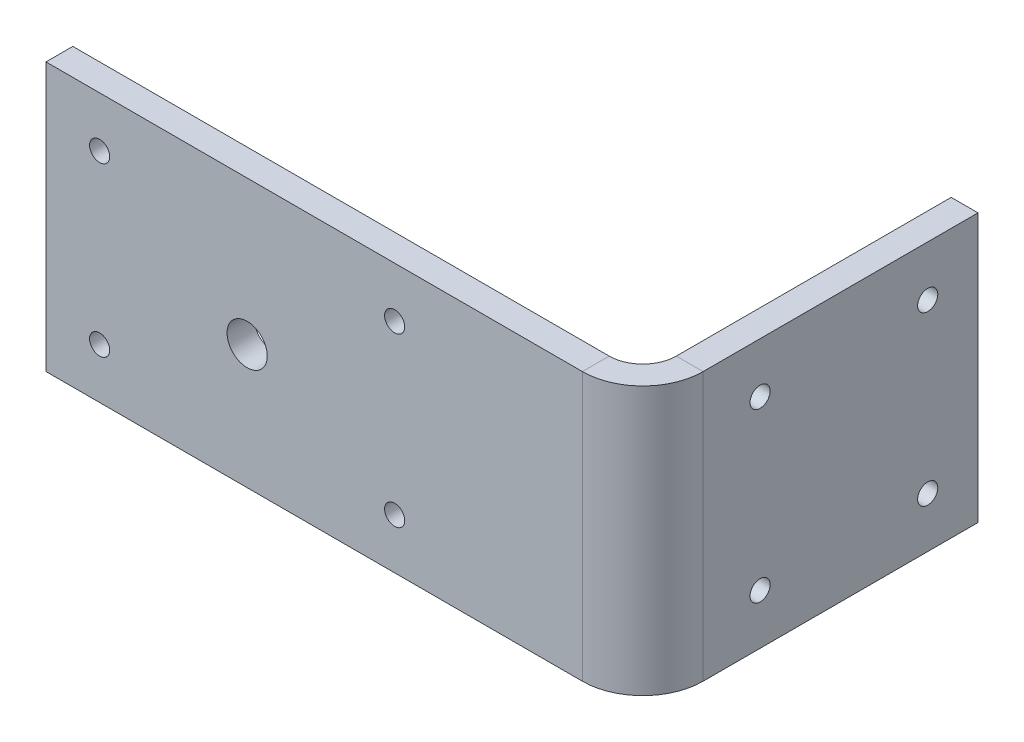
ISO-10303-21;
HEADER;
FILE_DESCRIPTION(('STEP AP214'),'2;1');
FILE_NAME('part.step','',(''),(''),'','','');
FILE_SCHEMA(('AUTOMOTIVE_DESIGN { 1 0 10303 214 1 1 1 1 }'));
ENDSEC;
DATA;
#1=APPLICATION_CONTEXT('core data for automotive mechanical design processes');
#2=APPLICATION_PROTOCOL_DEFINITION('international standard','automotive_design',2000,#1);
#3=PRODUCT_CONTEXT('',#1,'mechanical');
#4=PRODUCT('Part','Part','',(#3));
#5=PRODUCT_RELATED_PRODUCT_CATEGORY('part','',(#4));
#6=PRODUCT_DEFINITION_FORMATION('','',#4);
#7=PRODUCT_DEFINITION_CONTEXT('part definition',#1,'design');
#8=PRODUCT_DEFINITION('design','',#6,#7);
#9=PRODUCT_DEFINITION_SHAPE('','',#8);
#10=(LENGTH_UNIT() NAMED_UNIT(*) SI_UNIT(.MILLI.,.METRE.));
#11=(NAMED_UNIT(*) PLANE_ANGLE_UNIT() SI_UNIT($,.RADIAN.));
#12=(NAMED_UNIT(*) SI_UNIT($,.STERADIAN.) SOLID_ANGLE_UNIT());
#13=UNCERTAINTY_MEASURE_WITH_UNIT(LENGTH_MEASURE(1.E-05),#10,'distance_accuracy_value','');
#14=(GEOMETRIC_REPRESENTATION_CONTEXT(3) GLOBAL_UNCERTAINTY_ASSIGNED_CONTEXT((#13)) GLOBAL_UNIT_ASSIGNED_CONTEXT((#10,
#11,#12)) REPRESENTATION_CONTEXT('',''));
#15=CARTESIAN_POINT('',(0.,0.,0.));
#16=DIRECTION('',(0.,0.,1.));
#17=DIRECTION('',(1.,0.,0.));
#18=AXIS2_PLACEMENT_3D('',#15,#16,#17);
#19=CARTESIAN_POINT('',(-30.,-20.,0.));
#20=DIRECTION('',(1.,0.,0.));
#21=DIRECTION('',(0.,-1.,0.));
#22=AXIS2_PLACEMENT_3D('',#19,#20,#21);
#23=PLANE('',#22);
#24=DIRECTION('',(0.,0.,-1.));
#25=VECTOR('',#24,1.);
#26=CARTESIAN_POINT('',(-30.,-20.,0.));
#27=LINE('',#26,#25);
#28=CARTESIAN_POINT('',(-30.,-20.,4.));
#29=VERTEX_POINT('',#28);
#30=CARTESIAN_POINT('',(-30.,-20.,0.));
#31=VERTEX_POINT('',#30);
#32=EDGE_CURVE('E13',#29,#31,#27,.T.);
#33=ORIENTED_EDGE('',*,*,#32,.F.);
#34=DIRECTION('',(0.,1.,0.));
#35=VECTOR('',#34,1.);
#36=CARTESIAN_POINT('',(-30.,0.,4.));
#37=LINE('',#36,#35);
#38=CARTESIAN_POINT('',(-30.,20.,4.));
#39=VERTEX_POINT('',#38);
#40=EDGE_CURVE('E206',#39,#29,#37,.F.);
#41=ORIENTED_EDGE('',*,*,#40,.F.);
#42=DIRECTION('',(0.,0.,-1.));
#43=VECTOR('',#42,1.);
#44=CARTESIAN_POINT('',(-30.,20.,0.));
#45=LINE('',#44,#43);
#46=CARTESIAN_POINT('',(-30.,20.,0.));
#47=VERTEX_POINT('',#46);
#48=EDGE_CURVE('E67',#39,#47,#45,.T.);
#49=ORIENTED_EDGE('',*,*,#48,.T.);
#50=DIRECTION('',(0.,-1.,0.));
#51=VECTOR('',#50,1.);
#52=CARTESIAN_POINT('',(-30.,-20.,0.));
#53=LINE('',#52,#51);
#54=EDGE_CURVE('E182',#47,#31,#53,.T.);
#55=ORIENTED_EDGE('',*,*,#54,.T.);
#56=EDGE_LOOP('',(#33,#41,#49,#55));
#57=FACE_BOUND('',#56,.T.);
#58=ADVANCED_FACE('F57',(#57),#23,.F.);
#59=CARTESIAN_POINT('',(-30.,20.,0.));
#60=DIRECTION('',(0.,-1.,0.));
#61=DIRECTION('',(-1.,0.,0.));
#62=AXIS2_PLACEMENT_3D('',#59,#60,#61);
#63=PLANE('',#62);
#64=ORIENTED_EDGE('',*,*,#48,.F.);
#65=DIRECTION('',(-1.,0.,0.));
#66=VECTOR('',#65,1.);
#67=CARTESIAN_POINT('',(0.,20.,4.));
#68=LINE('',#67,#66);
#69=CARTESIAN_POINT('',(50.,20.,4.));
#70=VERTEX_POINT('',#69);
#71=EDGE_CURVE('E202',#70,#39,#68,.T.);
#72=ORIENTED_EDGE('',*,*,#71,.F.);
#73=DIRECTION('',(0.,0.,-1.));
#74=VECTOR('',#73,1.);
#75=CARTESIAN_POINT('',(50.,20.,0.));
#76=LINE('',#75,#74);
#77=CARTESIAN_POINT('',(50.,20.,0.));
#78=VERTEX_POINT('',#77);
#79=EDGE_CURVE('E217',#70,#78,#76,.T.);
#80=ORIENTED_EDGE('',*,*,#79,.T.);
#81=DIRECTION('',(-1.,0.,0.));
#82=VECTOR('',#81,1.);
#83=CARTESIAN_POINT('',(-30.,20.,0.));
#84=LINE('',#83,#82);
#85=EDGE_CURVE('E184',#78,#47,#84,.T.);
#86=ORIENTED_EDGE('',*,*,#85,.T.);
#87=EDGE_LOOP('',(#64,#72,#80,#86));
#88=FACE_BOUND('',#87,.T.);
#89=ADVANCED_FACE('F222',(#88),#63,.F.);
#90=CARTESIAN_POINT('',(22.,-12.5,0.));
#91=DIRECTION('',(0.,0.,1.));
#92=DIRECTION('',(1.,0.,0.));
#93=AXIS2_PLACEMENT_3D('',#90,#91,#92);
#94=CYLINDRICAL_SURFACE('',#93,1.5);
#95=CARTESIAN_POINT('',(22.,-12.5,0.));
#96=DIRECTION('',(0.,0.,1.));
#97=DIRECTION('',(1.,0.,0.));
#98=AXIS2_PLACEMENT_3D('',#95,#96,#97);
#99=CIRCLE('',#98,1.5);
#100=CARTESIAN_POINT('',(23.5,-12.5,0.));
#101=VERTEX_POINT('',#100);
#102=EDGE_CURVE('E170',#101,#101,#99,.T.);
#103=ORIENTED_EDGE('',*,*,#102,.F.);
#104=EDGE_LOOP('',(#103));
#105=FACE_BOUND('',#104,.T.);
#106=CARTESIAN_POINT('',(22.,-12.5,4.));
#107=DIRECTION('',(0.,0.,1.));
#108=DIRECTION('',(1.,0.,0.));
#109=AXIS2_PLACEMENT_3D('',#106,#107,#108);
#110=CIRCLE('',#109,1.5);
#111=CARTESIAN_POINT('',(23.5,-12.5,4.));
#112=VERTEX_POINT('',#111);
#113=EDGE_CURVE('E166',#112,#112,#110,.T.);
#114=ORIENTED_EDGE('',*,*,#113,.T.);
#115=EDGE_LOOP('',(#114));
#116=FACE_BOUND('',#115,.T.);
#117=ADVANCED_FACE('F233',(#105,#116),#94,.F.);
#118=CARTESIAN_POINT('',(-22.,12.5,0.));
#119=DIRECTION('',(0.,0.,1.));
#120=DIRECTION('',(1.,0.,0.));
#121=AXIS2_PLACEMENT_3D('',#118,#119,#120);
#122=CYLINDRICAL_SURFACE('',#121,1.5);
#123=CARTESIAN_POINT('',(-22.,12.5,0.));
#124=DIRECTION('',(0.,0.,1.));
#125=DIRECTION('',(1.,0.,0.));
#126=AXIS2_PLACEMENT_3D('',#123,#124,#125);
#127=CIRCLE('',#126,1.5);
#128=CARTESIAN_POINT('',(-20.5,12.5,0.));
#129=VERTEX_POINT('',#128);
#130=EDGE_CURVE('E173',#129,#129,#127,.T.);
#131=ORIENTED_EDGE('',*,*,#130,.F.);
#132=EDGE_LOOP('',(#131));
#133=FACE_BOUND('',#132,.T.);
#134=CARTESIAN_POINT('',(-22.,12.5,4.));
#135=DIRECTION('',(0.,0.,1.));
#136=DIRECTION('',(1.,0.,0.));
#137=AXIS2_PLACEMENT_3D('',#134,#135,#136);
#138=CIRCLE('',#137,1.5);
#139=CARTESIAN_POINT('',(-20.5,12.5,4.));
#140=VERTEX_POINT('',#139);
#141=EDGE_CURVE('E197',#140,#140,#138,.T.);
#142=ORIENTED_EDGE('',*,*,#141,.T.);
#143=EDGE_LOOP('',(#142));
#144=FACE_BOUND('',#143,.T.);
#145=ADVANCED_FACE('F241',(#133,#144),#122,.F.);
#146=CARTESIAN_POINT('',(-30.,-20.,0.));
#147=DIRECTION('',(0.,1.,0.));
#148=DIRECTION('',(1.,0.,0.));
#149=AXIS2_PLACEMENT_3D('',#146,#147,#148);
#150=PLANE('',#149);
#151=DIRECTION('',(-1.,0.,0.));
#152=VECTOR('',#151,1.);
#153=CARTESIAN_POINT('',(0.,-20.,4.));
#154=LINE('',#153,#152);
#155=CARTESIAN_POINT('',(50.,-20.,4.));
#156=VERTEX_POINT('',#155);
#157=EDGE_CURVE('E201',#29,#156,#154,.F.);
#158=ORIENTED_EDGE('',*,*,#157,.F.);
#159=ORIENTED_EDGE('',*,*,#32,.T.);
#160=DIRECTION('',(1.,0.,0.));
#161=VECTOR('',#160,1.);
#162=CARTESIAN_POINT('',(-30.,-20.,0.));
#163=LINE('',#162,#161);
#164=CARTESIAN_POINT('',(50.,-20.,0.));
#165=VERTEX_POINT('',#164);
#166=EDGE_CURVE('E179',#31,#165,#163,.T.);
#167=ORIENTED_EDGE('',*,*,#166,.T.);
#168=DIRECTION('',(0.,0.,-1.));
#169=VECTOR('',#168,1.);
#170=CARTESIAN_POINT('',(50.,-20.,0.));
#171=LINE('',#170,#169);
#172=EDGE_CURVE('E61',#156,#165,#171,.T.);
#173=ORIENTED_EDGE('',*,*,#172,.F.);
#174=EDGE_LOOP('',(#158,#159,#167,#173));
#175=FACE_BOUND('',#174,.T.);
#176=ADVANCED_FACE('F237',(#175),#150,.F.);
#177=CARTESIAN_POINT('',(22.,12.5,0.));
#178=DIRECTION('',(0.,0.,1.));
#179=DIRECTION('',(1.,0.,0.));
#180=AXIS2_PLACEMENT_3D('',#177,#178,#179);
#181=CYLINDRICAL_SURFACE('',#180,1.5);
#182=CARTESIAN_POINT('',(22.,12.5,0.));
#183=DIRECTION('',(0.,0.,1.));
#184=DIRECTION('',(1.,0.,0.));
#185=AXIS2_PLACEMENT_3D('',#182,#183,#184);
#186=CIRCLE('',#185,1.5);
#187=CARTESIAN_POINT('',(23.5,12.5,0.));
#188=VERTEX_POINT('',#187);
#189=EDGE_CURVE('E186',#188,#188,#186,.T.);
#190=ORIENTED_EDGE('',*,*,#189,.F.);
#191=EDGE_LOOP('',(#190));
#192=FACE_BOUND('',#191,.T.);
#193=CARTESIAN_POINT('',(22.,12.5,4.));
#194=DIRECTION('',(0.,0.,1.));
#195=DIRECTION('',(1.,0.,0.));
#196=AXIS2_PLACEMENT_3D('',#193,#194,#195);
#197=CIRCLE('',#196,1.5);
#198=CARTESIAN_POINT('',(23.5,12.5,4.));
#199=VERTEX_POINT('',#198);
#200=EDGE_CURVE('E205',#199,#199,#197,.T.);
#201=ORIENTED_EDGE('',*,*,#200,.T.);
#202=EDGE_LOOP('',(#201));
#203=FACE_BOUND('',#202,.T.);
#204=ADVANCED_FACE('F240',(#192,#203),#181,.F.);
#205=CARTESIAN_POINT('',(-22.,-12.5,0.));
#206=DIRECTION('',(0.,0.,1.));
#207=DIRECTION('',(1.,0.,0.));
#208=AXIS2_PLACEMENT_3D('',#205,#206,#207);
#209=CYLINDRICAL_SURFACE('',#208,1.5);
#210=CARTESIAN_POINT('',(-22.,-12.5,0.));
#211=DIRECTION('',(0.,0.,1.));
#212=DIRECTION('',(1.,0.,0.));
#213=AXIS2_PLACEMENT_3D('',#210,#211,#212);
#214=CIRCLE('',#213,1.5);
#215=CARTESIAN_POINT('',(-20.5,-12.5,0.));
#216=VERTEX_POINT('',#215);
#217=EDGE_CURVE('E189',#216,#216,#214,.T.);
#218=ORIENTED_EDGE('',*,*,#217,.F.);
#219=EDGE_LOOP('',(#218));
#220=FACE_BOUND('',#219,.T.);
#221=CARTESIAN_POINT('',(-22.,-12.5,4.));
#222=DIRECTION('',(0.,0.,1.));
#223=DIRECTION('',(1.,0.,0.));
#224=AXIS2_PLACEMENT_3D('',#221,#222,#223);
#225=CIRCLE('',#224,1.5);
#226=CARTESIAN_POINT('',(-20.5,-12.5,4.));
#227=VERTEX_POINT('',#226);
#228=EDGE_CURVE('E212',#227,#227,#225,.T.);
#229=ORIENTED_EDGE('',*,*,#228,.T.);
#230=EDGE_LOOP('',(#229));
#231=FACE_BOUND('',#230,.T.);
#232=ADVANCED_FACE('F244',(#220,#231),#209,.F.);
#233=CARTESIAN_POINT('',(0.,-1.5,0.));
#234=DIRECTION('',(0.,0.,1.));
#235=DIRECTION('',(1.,0.,0.));
#236=AXIS2_PLACEMENT_3D('',#233,#234,#235);
#237=CYLINDRICAL_SURFACE('',#236,3.);
#238=CARTESIAN_POINT('',(0.,-1.5,0.));
#239=DIRECTION('',(0.,0.,1.));
#240=DIRECTION('',(1.,0.,0.));
#241=AXIS2_PLACEMENT_3D('',#238,#239,#240);
#242=CIRCLE('',#241,3.);
#243=CARTESIAN_POINT('',(3.,-1.5,0.));
#244=VERTEX_POINT('',#243);
#245=EDGE_CURVE('E192',#244,#244,#242,.T.);
#246=ORIENTED_EDGE('',*,*,#245,.F.);
#247=EDGE_LOOP('',(#246));
#248=FACE_BOUND('',#247,.T.);
#249=CARTESIAN_POINT('',(0.,-1.5,4.));
#250=DIRECTION('',(0.,0.,1.));
#251=DIRECTION('',(1.,0.,0.));
#252=AXIS2_PLACEMENT_3D('',#249,#250,#251);
#253=CIRCLE('',#252,3.);
#254=CARTESIAN_POINT('',(3.,-1.5,4.));
#255=VERTEX_POINT('',#254);
#256=EDGE_CURVE('E174',#255,#255,#253,.T.);
#257=ORIENTED_EDGE('',*,*,#256,.T.);
#258=EDGE_LOOP('',(#257));
#259=FACE_BOUND('',#258,.T.);
#260=ADVANCED_FACE('F59',(#248,#259),#237,.F.);
#261=CARTESIAN_POINT('',(0.,0.,0.));
#262=DIRECTION('',(0.,0.,-1.));
#263=DIRECTION('',(-1.,0.,0.));
#264=AXIS2_PLACEMENT_3D('',#261,#262,#263);
#265=PLANE('',#264);
#266=ORIENTED_EDGE('',*,*,#102,.T.);
#267=EDGE_LOOP('',(#266));
#268=FACE_BOUND('',#267,.T.);
#269=ORIENTED_EDGE('',*,*,#130,.T.);
#270=EDGE_LOOP('',(#269));
#271=FACE_BOUND('',#270,.T.);
#272=DIRECTION('',(0.,1.,0.));
#273=VECTOR('',#272,1.);
#274=CARTESIAN_POINT('',(50.,-20.,0.));
#275=LINE('',#274,#273);
#276=EDGE_CURVE('E177',#165,#78,#275,.T.);
#277=ORIENTED_EDGE('',*,*,#276,.F.);
#278=ORIENTED_EDGE('',*,*,#166,.F.);
#279=ORIENTED_EDGE('',*,*,#54,.F.);
#280=ORIENTED_EDGE('',*,*,#85,.F.);
#281=EDGE_LOOP('',(#277,#278,#279,#280));
#282=FACE_BOUND('',#281,.T.);
#283=ORIENTED_EDGE('',*,*,#189,.T.);
#284=EDGE_LOOP('',(#283));
#285=FACE_BOUND('',#284,.T.);
#286=ORIENTED_EDGE('',*,*,#217,.T.);
#287=EDGE_LOOP('',(#286));
#288=FACE_BOUND('',#287,.T.);
#289=ORIENTED_EDGE('',*,*,#245,.T.);
#290=EDGE_LOOP('',(#289));
#291=FACE_BOUND('',#290,.T.);
#292=ADVANCED_FACE('F225',(#268,#271,#282,#285,#288,#291),#265,.T.);
#293=CARTESIAN_POINT('',(0.,0.,4.));
#294=DIRECTION('',(0.,0.,-1.));
#295=DIRECTION('',(-1.,0.,0.));
#296=AXIS2_PLACEMENT_3D('',#293,#294,#295);
#297=PLANE('',#296);
#298=ORIENTED_EDGE('',*,*,#113,.F.);
#299=EDGE_LOOP('',(#298));
#300=FACE_BOUND('',#299,.T.);
#301=ORIENTED_EDGE('',*,*,#141,.F.);
#302=EDGE_LOOP('',(#301));
#303=FACE_BOUND('',#302,.T.);
#304=DIRECTION('',(0.,1.,0.));
#305=VECTOR('',#304,1.);
#306=CARTESIAN_POINT('',(50.,0.,4.));
#307=LINE('',#306,#305);
#308=EDGE_CURVE('E94',#156,#70,#307,.T.);
#309=ORIENTED_EDGE('',*,*,#308,.T.);
#310=ORIENTED_EDGE('',*,*,#71,.T.);
#311=ORIENTED_EDGE('',*,*,#40,.T.);
#312=ORIENTED_EDGE('',*,*,#157,.T.);
#313=EDGE_LOOP('',(#309,#310,#311,#312));
#314=FACE_BOUND('',#313,.T.);
#315=ORIENTED_EDGE('',*,*,#200,.F.);
#316=EDGE_LOOP('',(#315));
#317=FACE_BOUND('',#316,.T.);
#318=ORIENTED_EDGE('',*,*,#228,.F.);
#319=EDGE_LOOP('',(#318));
#320=FACE_BOUND('',#319,.T.);
#321=ORIENTED_EDGE('',*,*,#256,.F.);
#322=EDGE_LOOP('',(#321));
#323=FACE_BOUND('',#322,.T.);
#324=ADVANCED_FACE('F256',(#300,#303,#314,#317,#320,#323),#297,.F.);
#325=CARTESIAN_POINT('',(50.,20.,-5.));
#326=DIRECTION('',(0.,1.,0.));
#327=DIRECTION('',(0.,0.,1.));
#328=AXIS2_PLACEMENT_3D('',#325,#326,#327);
#329=PLANE('',#328);
#330=DIRECTION('',(-1.,0.,0.));
#331=VECTOR('',#330,1.);
#332=CARTESIAN_POINT('',(59.,20.,-4.99999999999997));
#333=LINE('',#332,#331);
#334=CARTESIAN_POINT('',(55.,20.,-4.99999999999998));
#335=VERTEX_POINT('',#334);
#336=CARTESIAN_POINT('',(59.,20.,-4.99999999999997));
#337=VERTEX_POINT('',#336);
#338=EDGE_CURVE('E127',#335,#337,#333,.F.);
#339=ORIENTED_EDGE('',*,*,#338,.F.);
#340=CARTESIAN_POINT('',(50.,20.,-5.));
#341=DIRECTION('',(0.,-1.,0.));
#342=DIRECTION('',(0.,0.,-1.));
#343=AXIS2_PLACEMENT_3D('',#340,#341,#342);
#344=CIRCLE('',#343,5.);
#345=EDGE_CURVE('E121',#78,#335,#344,.F.);
#346=ORIENTED_EDGE('',*,*,#345,.F.);
#347=ORIENTED_EDGE('',*,*,#79,.F.);
#348=CARTESIAN_POINT('',(50.,20.,-5.));
#349=DIRECTION('',(0.,-1.,0.));
#350=DIRECTION('',(0.,0.,-1.));
#351=AXIS2_PLACEMENT_3D('',#348,#349,#350);
#352=CIRCLE('',#351,9.00000000000001);
#353=EDGE_CURVE('E163',#70,#337,#352,.F.);
#354=ORIENTED_EDGE('',*,*,#353,.T.);
#355=EDGE_LOOP('',(#339,#346,#347,#354));
#356=FACE_BOUND('',#355,.T.);
#357=ADVANCED_FACE('F259',(#356),#329,.T.);
#358=CARTESIAN_POINT('',(50.,-20.,-5.));
#359=DIRECTION('',(0.,1.,0.));
#360=DIRECTION('',(0.,0.,1.));
#361=AXIS2_PLACEMENT_3D('',#358,#359,#360);
#362=PLANE('',#361);
#363=CARTESIAN_POINT('',(50.,-20.,-5.));
#364=DIRECTION('',(0.,-1.,0.));
#365=DIRECTION('',(0.,0.,-1.));
#366=AXIS2_PLACEMENT_3D('',#363,#364,#365);
#367=CIRCLE('',#366,5.);
#368=CARTESIAN_POINT('',(55.,-20.,-4.99999999999998));
#369=VERTEX_POINT('',#368);
#370=EDGE_CURVE('E118',#369,#165,#367,.T.);
#371=ORIENTED_EDGE('',*,*,#370,.F.);
#372=DIRECTION('',(-1.,0.,0.));
#373=VECTOR('',#372,1.);
#374=CARTESIAN_POINT('',(55.,-20.,-4.99999999999998));
#375=LINE('',#374,#373);
#376=CARTESIAN_POINT('',(59.,-20.,-4.99999999999997));
#377=VERTEX_POINT('',#376);
#378=EDGE_CURVE('E126',#369,#377,#375,.F.);
#379=ORIENTED_EDGE('',*,*,#378,.T.);
#380=CARTESIAN_POINT('',(50.,-20.,-5.));
#381=DIRECTION('',(0.,-1.,0.));
#382=DIRECTION('',(0.,0.,-1.));
#383=AXIS2_PLACEMENT_3D('',#380,#381,#382);
#384=CIRCLE('',#383,9.00000000000001);
#385=EDGE_CURVE('E167',#377,#156,#384,.T.);
#386=ORIENTED_EDGE('',*,*,#385,.T.);
#387=ORIENTED_EDGE('',*,*,#172,.T.);
#388=EDGE_LOOP('',(#371,#379,#386,#387));
#389=FACE_BOUND('',#388,.T.);
#390=ADVANCED_FACE('F132',(#389),#362,.F.);
#391=CARTESIAN_POINT('',(50.,-20.,-5.));
#392=DIRECTION('',(0.,-1.,0.));
#393=DIRECTION('',(1.,0.,0.));
#394=AXIS2_PLACEMENT_3D('',#391,#392,#393);
#395=CYLINDRICAL_SURFACE('',#394,9.00000000000001);
#396=ORIENTED_EDGE('',*,*,#308,.F.);
#397=ORIENTED_EDGE('',*,*,#385,.F.);
#398=DIRECTION('',(0.,-1.,0.));
#399=VECTOR('',#398,1.);
#400=CARTESIAN_POINT('',(59.,20.,-4.99999999999997));
#401=LINE('',#400,#399);
#402=EDGE_CURVE('E148',#377,#337,#401,.F.);
#403=ORIENTED_EDGE('',*,*,#402,.T.);
#404=ORIENTED_EDGE('',*,*,#353,.F.);
#405=EDGE_LOOP('',(#396,#397,#403,#404));
#406=FACE_BOUND('',#405,.T.);
#407=ADVANCED_FACE('F381',(#406),#395,.T.);
#408=CARTESIAN_POINT('',(50.,-20.,-5.));
#409=DIRECTION('',(0.,-1.,0.));
#410=DIRECTION('',(1.,0.,0.));
#411=AXIS2_PLACEMENT_3D('',#408,#409,#410);
#412=CYLINDRICAL_SURFACE('',#411,5.);
#413=ORIENTED_EDGE('',*,*,#276,.T.);
#414=ORIENTED_EDGE('',*,*,#345,.T.);
#415=DIRECTION('',(0.,-1.,0.));
#416=VECTOR('',#415,1.);
#417=CARTESIAN_POINT('',(55.,20.,-4.99999999999998));
#418=LINE('',#417,#416);
#419=EDGE_CURVE('E115',#335,#369,#418,.T.);
#420=ORIENTED_EDGE('',*,*,#419,.T.);
#421=ORIENTED_EDGE('',*,*,#370,.T.);
#422=EDGE_LOOP('',(#413,#414,#420,#421));
#423=FACE_BOUND('',#422,.T.);
#424=ADVANCED_FACE('F117',(#423),#412,.F.);
#425=CARTESIAN_POINT('',(59.0000000000001,-20.,-46.));
#426=DIRECTION('',(0.,1.,0.));
#427=DIRECTION('',(0.,0.,1.));
#428=AXIS2_PLACEMENT_3D('',#425,#426,#427);
#429=PLANE('',#428);
#430=ORIENTED_EDGE('',*,*,#378,.F.);
#431=DIRECTION('',(0.,0.,1.));
#432=VECTOR('',#431,1.);
#433=CARTESIAN_POINT('',(55.0000000000001,-20.,-46.));
#434=LINE('',#433,#432);
#435=CARTESIAN_POINT('',(55.0000000000001,-20.,-46.));
#436=VERTEX_POINT('',#435);
#437=EDGE_CURVE('E144',#369,#436,#434,.F.);
#438=ORIENTED_EDGE('',*,*,#437,.T.);
#439=DIRECTION('',(-1.,0.,0.));
#440=VECTOR('',#439,1.);
#441=CARTESIAN_POINT('',(59.0000000000001,-20.,-46.));
#442=LINE('',#441,#440);
#443=CARTESIAN_POINT('',(59.0000000000001,-20.,-46.));
#444=VERTEX_POINT('',#443);
#445=EDGE_CURVE('E136',#444,#436,#442,.T.);
#446=ORIENTED_EDGE('',*,*,#445,.F.);
#447=DIRECTION('',(0.,0.,-1.));
#448=VECTOR('',#447,1.);
#449=CARTESIAN_POINT('',(59.,-20.,1.87438272953053E-13));
#450=LINE('',#449,#448);
#451=EDGE_CURVE('E147',#377,#444,#450,.T.);
#452=ORIENTED_EDGE('',*,*,#451,.F.);
#453=EDGE_LOOP('',(#430,#438,#446,#452));
#454=FACE_BOUND('',#453,.T.);
#455=ADVANCED_FACE('F141',(#454),#429,.F.);
#456=CARTESIAN_POINT('',(59.,20.,0.));
#457=DIRECTION('',(0.,-1.,0.));
#458=DIRECTION('',(0.,0.,-1.));
#459=AXIS2_PLACEMENT_3D('',#456,#457,#458);
#460=PLANE('',#459);
#461=ORIENTED_EDGE('',*,*,#338,.T.);
#462=DIRECTION('',(0.,0.,1.));
#463=VECTOR('',#462,1.);
#464=CARTESIAN_POINT('',(59.,20.,1.87438272953053E-13));
#465=LINE('',#464,#463);
#466=CARTESIAN_POINT('',(59.0000000000001,20.,-46.));
#467=VERTEX_POINT('',#466);
#468=EDGE_CURVE('E559',#467,#337,#465,.T.);
#469=ORIENTED_EDGE('',*,*,#468,.F.);
#470=DIRECTION('',(-1.,0.,0.));
#471=VECTOR('',#470,1.);
#472=CARTESIAN_POINT('',(59.0000000000001,20.,-46.));
#473=LINE('',#472,#471);
#474=CARTESIAN_POINT('',(55.0000000000001,20.,-46.));
#475=VERTEX_POINT('',#474);
#476=EDGE_CURVE('E556',#467,#475,#473,.T.);
#477=ORIENTED_EDGE('',*,*,#476,.T.);
#478=DIRECTION('',(0.,0.,-1.));
#479=VECTOR('',#478,1.);
#480=CARTESIAN_POINT('',(55.,20.,0.));
#481=LINE('',#480,#479);
#482=EDGE_CURVE('E155',#475,#335,#481,.F.);
#483=ORIENTED_EDGE('',*,*,#482,.T.);
#484=EDGE_LOOP('',(#461,#469,#477,#483));
#485=FACE_BOUND('',#484,.T.);
#486=ADVANCED_FACE('F405',(#485),#460,.F.);
#487=CARTESIAN_POINT('',(59.,0.,1.87438272953053E-13));
#488=DIRECTION('',(-1.,0.,0.));
#489=DIRECTION('',(0.,0.,1.));
#490=AXIS2_PLACEMENT_3D('',#487,#488,#489);
#491=PLANE('',#490);
#492=CARTESIAN_POINT('',(59.0000000000001,-12.5,-38.4999999999999));
#493=DIRECTION('',(-1.,0.,0.));
#494=DIRECTION('',(0.,0.,1.));
#495=AXIS2_PLACEMENT_3D('',#492,#493,#494);
#496=CIRCLE('',#495,1.5);
#497=CARTESIAN_POINT('',(59.0000000000001,-12.5,-36.9999999999999));
#498=VERTEX_POINT('',#497);
#499=EDGE_CURVE('E531',#498,#498,#496,.T.);
#500=ORIENTED_EDGE('',*,*,#499,.T.);
#501=EDGE_LOOP('',(#500));
#502=FACE_BOUND('',#501,.T.);
#503=CARTESIAN_POINT('',(59.,-12.5,-13.4999999999999));
#504=DIRECTION('',(-1.,0.,0.));
#505=DIRECTION('',(0.,0.,1.));
#506=AXIS2_PLACEMENT_3D('',#503,#504,#505);
#507=CIRCLE('',#506,1.5);
#508=CARTESIAN_POINT('',(59.,-12.5,-11.9999999999999));
#509=VERTEX_POINT('',#508);
#510=EDGE_CURVE('E539',#509,#509,#507,.T.);
#511=ORIENTED_EDGE('',*,*,#510,.T.);
#512=EDGE_LOOP('',(#511));
#513=FACE_BOUND('',#512,.T.);
#514=CARTESIAN_POINT('',(59.,12.5,-13.4999999999999));
#515=DIRECTION('',(-1.,0.,0.));
#516=DIRECTION('',(0.,0.,1.));
#517=AXIS2_PLACEMENT_3D('',#514,#515,#516);
#518=CIRCLE('',#517,1.5);
#519=CARTESIAN_POINT('',(59.,12.5,-11.9999999999999));
#520=VERTEX_POINT('',#519);
#521=EDGE_CURVE('E545',#520,#520,#518,.T.);
#522=ORIENTED_EDGE('',*,*,#521,.T.);
#523=EDGE_LOOP('',(#522));
#524=FACE_BOUND('',#523,.T.);
#525=CARTESIAN_POINT('',(59.0000000000001,12.5,-38.4999999999999));
#526=DIRECTION('',(-1.,0.,0.));
#527=DIRECTION('',(0.,0.,1.));
#528=AXIS2_PLACEMENT_3D('',#525,#526,#527);
#529=CIRCLE('',#528,1.5);
#530=CARTESIAN_POINT('',(59.0000000000001,12.5,-36.9999999999999));
#531=VERTEX_POINT('',#530);
#532=EDGE_CURVE('E162',#531,#531,#529,.T.);
#533=ORIENTED_EDGE('',*,*,#532,.T.);
#534=EDGE_LOOP('',(#533));
#535=FACE_BOUND('',#534,.T.);
#536=ORIENTED_EDGE('',*,*,#402,.F.);
#537=ORIENTED_EDGE('',*,*,#451,.T.);
#538=DIRECTION('',(0.,1.,0.));
#539=VECTOR('',#538,1.);
#540=CARTESIAN_POINT('',(59.0000000000001,0.,-46.));
#541=LINE('',#540,#539);
#542=EDGE_CURVE('E562',#444,#467,#541,.T.);
#543=ORIENTED_EDGE('',*,*,#542,.T.);
#544=ORIENTED_EDGE('',*,*,#468,.T.);
#545=EDGE_LOOP('',(#536,#537,#543,#544));
#546=FACE_BOUND('',#545,.T.);
#547=ADVANCED_FACE('F414',(#502,#513,#524,#535,#546),#491,.F.);
#548=CARTESIAN_POINT('',(55.,0.,1.73472347597681E-13));
#549=DIRECTION('',(-1.,0.,0.));
#550=DIRECTION('',(0.,0.,1.));
#551=AXIS2_PLACEMENT_3D('',#548,#549,#550);
#552=PLANE('',#551);
#553=CARTESIAN_POINT('',(55.0000000000001,-12.5,-38.5));
#554=DIRECTION('',(-1.,0.,0.));
#555=DIRECTION('',(0.,0.,1.));
#556=AXIS2_PLACEMENT_3D('',#553,#554,#555);
#557=CIRCLE('',#556,1.5);
#558=CARTESIAN_POINT('',(55.0000000000001,-12.5,-37.));
#559=VERTEX_POINT('',#558);
#560=EDGE_CURVE('E534',#559,#559,#557,.T.);
#561=ORIENTED_EDGE('',*,*,#560,.F.);
#562=EDGE_LOOP('',(#561));
#563=FACE_BOUND('',#562,.T.);
#564=CARTESIAN_POINT('',(55.,-12.5,-13.4999999999999));
#565=DIRECTION('',(-1.,0.,0.));
#566=DIRECTION('',(0.,0.,1.));
#567=AXIS2_PLACEMENT_3D('',#564,#565,#566);
#568=CIRCLE('',#567,1.5);
#569=CARTESIAN_POINT('',(55.,-12.5,-11.9999999999999));
#570=VERTEX_POINT('',#569);
#571=EDGE_CURVE('E536',#570,#570,#568,.T.);
#572=ORIENTED_EDGE('',*,*,#571,.F.);
#573=EDGE_LOOP('',(#572));
#574=FACE_BOUND('',#573,.T.);
#575=CARTESIAN_POINT('',(55.,12.5,-13.4999999999999));
#576=DIRECTION('',(-1.,0.,0.));
#577=DIRECTION('',(0.,0.,1.));
#578=AXIS2_PLACEMENT_3D('',#575,#576,#577);
#579=CIRCLE('',#578,1.5);
#580=CARTESIAN_POINT('',(55.,12.5,-11.9999999999999));
#581=VERTEX_POINT('',#580);
#582=EDGE_CURVE('E542',#581,#581,#579,.T.);
#583=ORIENTED_EDGE('',*,*,#582,.F.);
#584=EDGE_LOOP('',(#583));
#585=FACE_BOUND('',#584,.T.);
#586=CARTESIAN_POINT('',(55.0000000000001,12.5,-38.5));
#587=DIRECTION('',(-1.,0.,0.));
#588=DIRECTION('',(0.,0.,1.));
#589=AXIS2_PLACEMENT_3D('',#586,#587,#588);
#590=CIRCLE('',#589,1.5);
#591=CARTESIAN_POINT('',(55.0000000000001,12.5,-37.));
#592=VERTEX_POINT('',#591);
#593=EDGE_CURVE('E548',#592,#592,#590,.T.);
#594=ORIENTED_EDGE('',*,*,#593,.F.);
#595=EDGE_LOOP('',(#594));
#596=FACE_BOUND('',#595,.T.);
#597=ORIENTED_EDGE('',*,*,#437,.F.);
#598=ORIENTED_EDGE('',*,*,#419,.F.);
#599=ORIENTED_EDGE('',*,*,#482,.F.);
#600=DIRECTION('',(0.,-1.,0.));
#601=VECTOR('',#600,1.);
#602=CARTESIAN_POINT('',(55.0000000000001,20.,-46.));
#603=LINE('',#602,#601);
#604=EDGE_CURVE('E152',#436,#475,#603,.F.);
#605=ORIENTED_EDGE('',*,*,#604,.F.);
#606=EDGE_LOOP('',(#597,#598,#599,#605));
#607=FACE_BOUND('',#606,.T.);
#608=ADVANCED_FACE('F150',(#563,#574,#585,#596,#607),#552,.T.);
#609=CARTESIAN_POINT('',(59.0000000000001,20.,-46.));
#610=DIRECTION('',(0.,0.,1.));
#611=DIRECTION('',(1.,0.,0.));
#612=AXIS2_PLACEMENT_3D('',#609,#610,#611);
#613=PLANE('',#612);
#614=ORIENTED_EDGE('',*,*,#604,.T.);
#615=ORIENTED_EDGE('',*,*,#476,.F.);
#616=ORIENTED_EDGE('',*,*,#542,.F.);
#617=ORIENTED_EDGE('',*,*,#445,.T.);
#618=EDGE_LOOP('',(#614,#615,#616,#617));
#619=FACE_BOUND('',#618,.T.);
#620=ADVANCED_FACE('F433',(#619),#613,.F.);
#621=CARTESIAN_POINT('',(59.0000000000001,12.5,-38.4999999999999));
#622=DIRECTION('',(-1.,0.,0.));
#623=DIRECTION('',(0.,0.,1.));
#624=AXIS2_PLACEMENT_3D('',#621,#622,#623);
#625=CYLINDRICAL_SURFACE('',#624,1.5);
#626=ORIENTED_EDGE('',*,*,#532,.F.);
#627=EDGE_LOOP('',(#626));
#628=FACE_BOUND('',#627,.T.);
#629=ORIENTED_EDGE('',*,*,#593,.T.);
#630=EDGE_LOOP('',(#629));
#631=FACE_BOUND('',#630,.T.);
#632=ADVANCED_FACE('F443',(#628,#631),#625,.F.);
#633=CARTESIAN_POINT('',(59.,12.5,-13.4999999999999));
#634=DIRECTION('',(-1.,0.,0.));
#635=DIRECTION('',(0.,0.,1.));
#636=AXIS2_PLACEMENT_3D('',#633,#634,#635);
#637=CYLINDRICAL_SURFACE('',#636,1.5);
#638=ORIENTED_EDGE('',*,*,#521,.F.);
#639=EDGE_LOOP('',(#638));
#640=FACE_BOUND('',#639,.T.);
#641=ORIENTED_EDGE('',*,*,#582,.T.);
#642=EDGE_LOOP('',(#641));
#643=FACE_BOUND('',#642,.T.);
#644=ADVANCED_FACE('F453',(#640,#643),#637,.F.);
#645=CARTESIAN_POINT('',(59.,-12.5,-13.4999999999999));
#646=DIRECTION('',(-1.,0.,0.));
#647=DIRECTION('',(0.,0.,1.));
#648=AXIS2_PLACEMENT_3D('',#645,#646,#647);
#649=CYLINDRICAL_SURFACE('',#648,1.5);
#650=ORIENTED_EDGE('',*,*,#510,.F.);
#651=EDGE_LOOP('',(#650));
#652=FACE_BOUND('',#651,.T.);
#653=ORIENTED_EDGE('',*,*,#571,.T.);
#654=EDGE_LOOP('',(#653));
#655=FACE_BOUND('',#654,.T.);
#656=ADVANCED_FACE('F463',(#652,#655),#649,.F.);
#657=CARTESIAN_POINT('',(59.0000000000001,-12.5,-38.4999999999999));
#658=DIRECTION('',(-1.,0.,0.));
#659=DIRECTION('',(0.,0.,1.));
#660=AXIS2_PLACEMENT_3D('',#657,#658,#659);
#661=CYLINDRICAL_SURFACE('',#660,1.5);
#662=ORIENTED_EDGE('',*,*,#499,.F.);
#663=EDGE_LOOP('',(#662));
#664=FACE_BOUND('',#663,.T.);
#665=ORIENTED_EDGE('',*,*,#560,.T.);
#666=EDGE_LOOP('',(#665));
#667=FACE_BOUND('',#666,.T.);
#668=ADVANCED_FACE('F473',(#664,#667),#661,.F.);
#669=CLOSED_SHELL('',(#58,#89,#117,#145,#176,#204,#232,#260,#292,#324,#357,#390,#407,#424,#455,
#486,#547,#608,#620,#632,#644,#656,#668));
#670=MANIFOLD_SOLID_BREP('B2',#669);
#671=ADVANCED_BREP_SHAPE_REPRESENTATION('',(#18,#670),#14);
#672=SHAPE_DEFINITION_REPRESENTATION(#9,#671);
ENDSEC;
END-ISO-10303-21;
